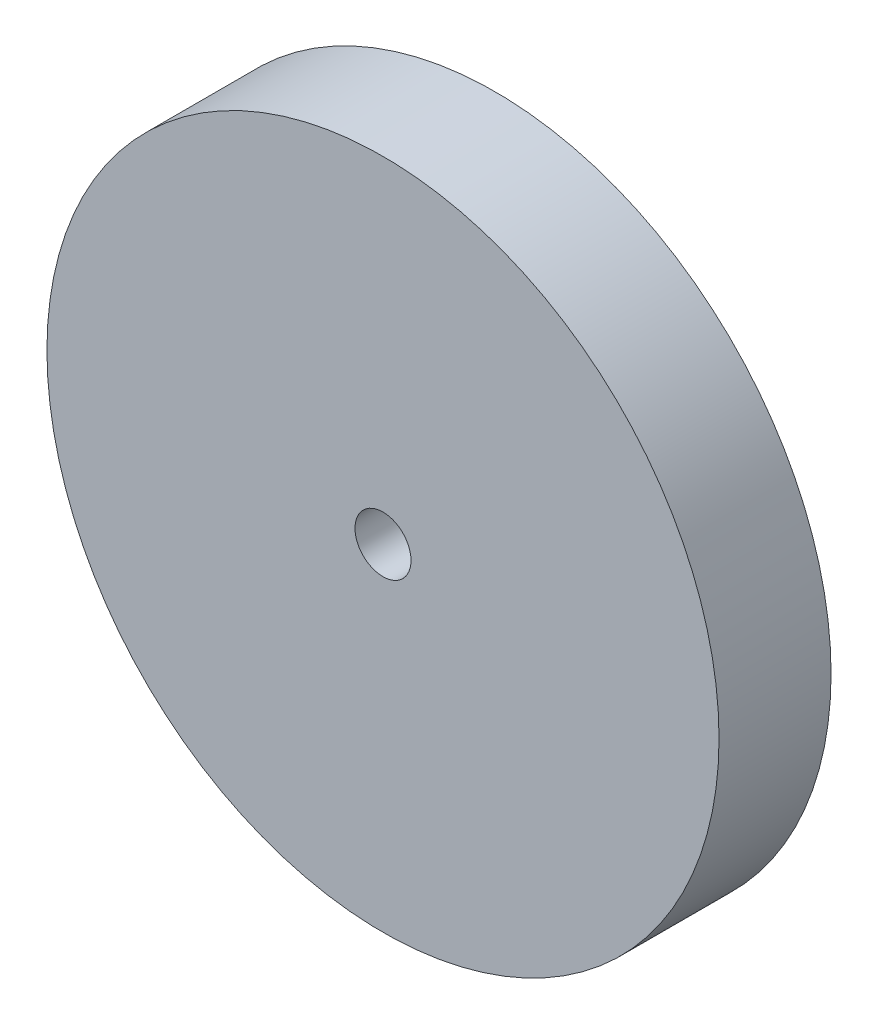
ISO-10303-21;
HEADER;
FILE_DESCRIPTION(('STEP AP214'),'2;1');
FILE_NAME('part.step','',(''),(''),'','','');
FILE_SCHEMA(('AUTOMOTIVE_DESIGN { 1 0 10303 214 1 1 1 1 }'));
ENDSEC;
DATA;
#1=APPLICATION_CONTEXT('core data for automotive mechanical design processes');
#2=APPLICATION_PROTOCOL_DEFINITION('international standard','automotive_design',2000,#1);
#3=PRODUCT_CONTEXT('',#1,'mechanical');
#4=PRODUCT('Part','Part','',(#3));
#5=PRODUCT_RELATED_PRODUCT_CATEGORY('part','',(#4));
#6=PRODUCT_DEFINITION_FORMATION('','',#4);
#7=PRODUCT_DEFINITION_CONTEXT('part definition',#1,'design');
#8=PRODUCT_DEFINITION('design','',#6,#7);
#9=PRODUCT_DEFINITION_SHAPE('','',#8);
#10=(LENGTH_UNIT() NAMED_UNIT(*) SI_UNIT(.MILLI.,.METRE.));
#11=(NAMED_UNIT(*) PLANE_ANGLE_UNIT() SI_UNIT($,.RADIAN.));
#12=(NAMED_UNIT(*) SI_UNIT($,.STERADIAN.) SOLID_ANGLE_UNIT());
#13=UNCERTAINTY_MEASURE_WITH_UNIT(LENGTH_MEASURE(1.E-05),#10,'distance_accuracy_value','');
#14=(GEOMETRIC_REPRESENTATION_CONTEXT(3) GLOBAL_UNCERTAINTY_ASSIGNED_CONTEXT((#13)) GLOBAL_UNIT_ASSIGNED_CONTEXT((#10,
#11,#12)) REPRESENTATION_CONTEXT('',''));
#15=CARTESIAN_POINT('',(0.,0.,0.));
#16=DIRECTION('',(0.,0.,1.));
#17=DIRECTION('',(1.,0.,0.));
#18=AXIS2_PLACEMENT_3D('',#15,#16,#17);
#19=CARTESIAN_POINT('',(0.,0.,12.7));
#20=DIRECTION('',(0.,0.,1.));
#21=DIRECTION('',(1.,0.,0.));
#22=AXIS2_PLACEMENT_3D('',#19,#20,#21);
#23=PLANE('',#22);
#24=CARTESIAN_POINT('',(0.,0.,12.7));
#25=DIRECTION('',(0.,0.,1.));
#26=DIRECTION('',(1.,0.,0.));
#27=AXIS2_PLACEMENT_3D('',#24,#25,#26);
#28=CIRCLE('',#27,38.1);
#29=CARTESIAN_POINT('',(38.1,0.,12.7));
#30=VERTEX_POINT('',#29);
#31=EDGE_CURVE('E10',#30,#30,#28,.T.);
#32=ORIENTED_EDGE('',*,*,#31,.T.);
#33=EDGE_LOOP('',(#32));
#34=FACE_BOUND('',#33,.T.);
#35=CARTESIAN_POINT('',(0.,0.,12.7));
#36=DIRECTION('',(0.,0.,1.));
#37=DIRECTION('',(1.,0.,0.));
#38=AXIS2_PLACEMENT_3D('',#35,#36,#37);
#39=CIRCLE('',#38,3.175);
#40=CARTESIAN_POINT('',(3.175,0.,12.7));
#41=VERTEX_POINT('',#40);
#42=EDGE_CURVE('E42',#41,#41,#39,.T.);
#43=ORIENTED_EDGE('',*,*,#42,.F.);
#44=EDGE_LOOP('',(#43));
#45=FACE_BOUND('',#44,.T.);
#46=ADVANCED_FACE('F31',(#34,#45),#23,.T.);
#47=CARTESIAN_POINT('',(0.,0.,0.));
#48=DIRECTION('',(0.,0.,1.));
#49=DIRECTION('',(1.,0.,0.));
#50=AXIS2_PLACEMENT_3D('',#47,#48,#49);
#51=PLANE('',#50);
#52=CARTESIAN_POINT('',(0.,0.,0.));
#53=DIRECTION('',(0.,0.,1.));
#54=DIRECTION('',(1.,0.,0.));
#55=AXIS2_PLACEMENT_3D('',#52,#53,#54);
#56=CIRCLE('',#55,38.1);
#57=CARTESIAN_POINT('',(38.1,0.,0.));
#58=VERTEX_POINT('',#57);
#59=EDGE_CURVE('E35',#58,#58,#56,.T.);
#60=ORIENTED_EDGE('',*,*,#59,.F.);
#61=EDGE_LOOP('',(#60));
#62=FACE_BOUND('',#61,.T.);
#63=CARTESIAN_POINT('',(0.,0.,0.));
#64=DIRECTION('',(0.,0.,1.));
#65=DIRECTION('',(1.,0.,0.));
#66=AXIS2_PLACEMENT_3D('',#63,#64,#65);
#67=CIRCLE('',#66,3.175);
#68=CARTESIAN_POINT('',(3.175,0.,0.));
#69=VERTEX_POINT('',#68);
#70=EDGE_CURVE('E44',#69,#69,#67,.T.);
#71=ORIENTED_EDGE('',*,*,#70,.T.);
#72=EDGE_LOOP('',(#71));
#73=FACE_BOUND('',#72,.T.);
#74=ADVANCED_FACE('F54',(#62,#73),#51,.F.);
#75=CARTESIAN_POINT('',(0.,0.,12.7));
#76=DIRECTION('',(0.,0.,-1.));
#77=DIRECTION('',(-1.,0.,0.));
#78=AXIS2_PLACEMENT_3D('',#75,#76,#77);
#79=CYLINDRICAL_SURFACE('',#78,38.1);
#80=ORIENTED_EDGE('',*,*,#31,.F.);
#81=EDGE_LOOP('',(#80));
#82=FACE_BOUND('',#81,.T.);
#83=ORIENTED_EDGE('',*,*,#59,.T.);
#84=EDGE_LOOP('',(#83));
#85=FACE_BOUND('',#84,.T.);
#86=ADVANCED_FACE('F33',(#82,#85),#79,.T.);
#87=CARTESIAN_POINT('',(0.,0.,12.7));
#88=DIRECTION('',(0.,0.,-1.));
#89=DIRECTION('',(-1.,0.,0.));
#90=AXIS2_PLACEMENT_3D('',#87,#88,#89);
#91=CYLINDRICAL_SURFACE('',#90,3.175);
#92=ORIENTED_EDGE('',*,*,#42,.T.);
#93=EDGE_LOOP('',(#92));
#94=FACE_BOUND('',#93,.T.);
#95=ORIENTED_EDGE('',*,*,#70,.F.);
#96=EDGE_LOOP('',(#95));
#97=FACE_BOUND('',#96,.T.);
#98=ADVANCED_FACE('F50',(#94,#97),#91,.F.);
#99=CLOSED_SHELL('',(#46,#74,#86,#98));
#100=MANIFOLD_SOLID_BREP('B2',#99);
#101=ADVANCED_BREP_SHAPE_REPRESENTATION('',(#18,#100),#14);
#102=SHAPE_DEFINITION_REPRESENTATION(#9,#101);
ENDSEC;
END-ISO-10303-21;
